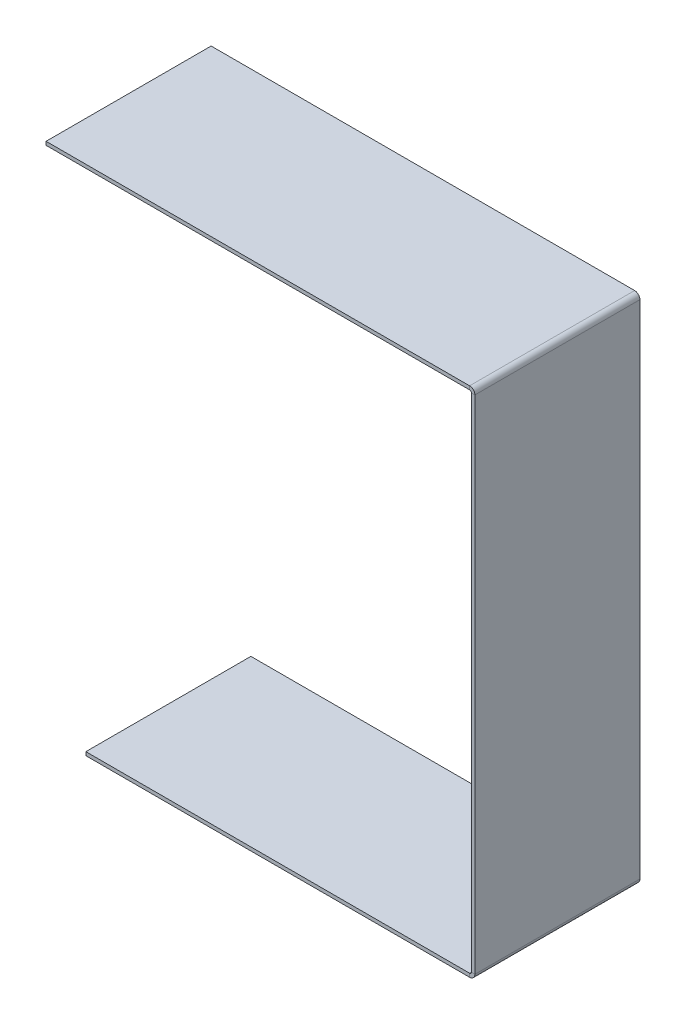
ISO-10303-21;
HEADER;
FILE_DESCRIPTION(('STEP AP214'),'2;1');
FILE_NAME('part.step','',(''),(''),'','','');
FILE_SCHEMA(('AUTOMOTIVE_DESIGN { 1 0 10303 214 1 1 1 1 }'));
ENDSEC;
DATA;
#1=APPLICATION_CONTEXT('core data for automotive mechanical design processes');
#2=APPLICATION_PROTOCOL_DEFINITION('international standard','automotive_design',2000,#1);
#3=PRODUCT_CONTEXT('',#1,'mechanical');
#4=PRODUCT('Part','Part','',(#3));
#5=PRODUCT_RELATED_PRODUCT_CATEGORY('part','',(#4));
#6=PRODUCT_DEFINITION_FORMATION('','',#4);
#7=PRODUCT_DEFINITION_CONTEXT('part definition',#1,'design');
#8=PRODUCT_DEFINITION('design','',#6,#7);
#9=PRODUCT_DEFINITION_SHAPE('','',#8);
#10=(LENGTH_UNIT() NAMED_UNIT(*) SI_UNIT(.MILLI.,.METRE.));
#11=(NAMED_UNIT(*) PLANE_ANGLE_UNIT() SI_UNIT($,.RADIAN.));
#12=(NAMED_UNIT(*) SI_UNIT($,.STERADIAN.) SOLID_ANGLE_UNIT());
#13=UNCERTAINTY_MEASURE_WITH_UNIT(LENGTH_MEASURE(1.E-05),#10,'distance_accuracy_value','');
#14=(GEOMETRIC_REPRESENTATION_CONTEXT(3) GLOBAL_UNCERTAINTY_ASSIGNED_CONTEXT((#13)) GLOBAL_UNIT_ASSIGNED_CONTEXT((#10,
#11,#12)) REPRESENTATION_CONTEXT('',''));
#15=CARTESIAN_POINT('',(0.,0.,0.));
#16=DIRECTION('',(0.,0.,1.));
#17=DIRECTION('',(1.,0.,0.));
#18=AXIS2_PLACEMENT_3D('',#15,#16,#17);
#19=CARTESIAN_POINT('',(-96.8897999999983,104.546799999999,93.673110700402));
#20=DIRECTION('',(1.,0.,0.));
#21=DIRECTION('',(0.,0.,-1.));
#22=AXIS2_PLACEMENT_3D('',#19,#20,#21);
#23=PLANE('',#22);
#24=DIRECTION('',(0.,0.,1.));
#25=VECTOR('',#24,1.);
#26=CARTESIAN_POINT('',(-96.8897999999983,103.046799999999,93.673110700402));
#27=LINE('',#26,#25);
#28=CARTESIAN_POINT('',(-96.8897999999983,103.046799999999,93.673110700402));
#29=VERTEX_POINT('',#28);
#30=CARTESIAN_POINT('',(-96.8897999999983,103.046799999999,163.673110700402));
#31=VERTEX_POINT('',#30);
#32=EDGE_CURVE('E143',#29,#31,#27,.T.);
#33=ORIENTED_EDGE('',*,*,#32,.T.);
#34=DIRECTION('',(0.,-1.,0.));
#35=VECTOR('',#34,1.);
#36=CARTESIAN_POINT('',(-96.8897999999983,104.546799999999,163.673110700402));
#37=LINE('',#36,#35);
#38=CARTESIAN_POINT('',(-96.8897999999983,104.546799999999,163.673110700402));
#39=VERTEX_POINT('',#38);
#40=EDGE_CURVE('E13',#39,#31,#37,.T.);
#41=ORIENTED_EDGE('',*,*,#40,.F.);
#42=DIRECTION('',(0.,0.,1.));
#43=VECTOR('',#42,1.);
#44=CARTESIAN_POINT('',(-96.8897999999983,104.546799999999,93.673110700402));
#45=LINE('',#44,#43);
#46=CARTESIAN_POINT('',(-96.8897999999983,104.546799999999,93.673110700402));
#47=VERTEX_POINT('',#46);
#48=EDGE_CURVE('E135',#47,#39,#45,.T.);
#49=ORIENTED_EDGE('',*,*,#48,.F.);
#50=DIRECTION('',(0.,-1.,0.));
#51=VECTOR('',#50,1.);
#52=CARTESIAN_POINT('',(-96.8897999999983,104.546799999999,93.673110700402));
#53=LINE('',#52,#51);
#54=EDGE_CURVE('E144',#47,#29,#53,.T.);
#55=ORIENTED_EDGE('',*,*,#54,.T.);
#56=EDGE_LOOP('',(#33,#41,#49,#55));
#57=FACE_BOUND('',#56,.T.);
#58=ADVANCED_FACE('F73',(#57),#23,.F.);
#59=CARTESIAN_POINT('',(-96.8897999999983,104.546799999999,163.673110700402));
#60=DIRECTION('',(0.,0.,-1.));
#61=DIRECTION('',(-1.,0.,0.));
#62=AXIS2_PLACEMENT_3D('',#59,#60,#61);
#63=PLANE('',#62);
#64=DIRECTION('',(1.,0.,0.));
#65=VECTOR('',#64,1.);
#66=CARTESIAN_POINT('',(-96.8897999999983,103.046799999999,163.673110700402));
#67=LINE('',#66,#65);
#68=CARTESIAN_POINT('',(82.7436000000014,103.046799999999,163.673110700401));
#69=VERTEX_POINT('',#68);
#70=EDGE_CURVE('E102',#31,#69,#67,.T.);
#71=ORIENTED_EDGE('',*,*,#70,.T.);
#72=DIRECTION('',(0.,-1.,0.));
#73=VECTOR('',#72,1.);
#74=CARTESIAN_POINT('',(82.7436000000014,104.546799999999,163.673110700401));
#75=LINE('',#74,#73);
#76=CARTESIAN_POINT('',(82.7436000000014,104.546799999999,163.673110700401));
#77=VERTEX_POINT('',#76);
#78=EDGE_CURVE('E81',#77,#69,#75,.T.);
#79=ORIENTED_EDGE('',*,*,#78,.F.);
#80=DIRECTION('',(1.,0.,0.));
#81=VECTOR('',#80,1.);
#82=CARTESIAN_POINT('',(-96.8897999999983,104.546799999999,163.673110700402));
#83=LINE('',#82,#81);
#84=EDGE_CURVE('E131',#39,#77,#83,.T.);
#85=ORIENTED_EDGE('',*,*,#84,.F.);
#86=ORIENTED_EDGE('',*,*,#40,.T.);
#87=EDGE_LOOP('',(#71,#79,#85,#86));
#88=FACE_BOUND('',#87,.T.);
#89=ADVANCED_FACE('F132',(#88),#63,.F.);
#90=CARTESIAN_POINT('',(-96.8897999999983,104.546799999999,93.673110700402));
#91=DIRECTION('',(0.,0.,1.));
#92=DIRECTION('',(1.,0.,0.));
#93=AXIS2_PLACEMENT_3D('',#90,#91,#92);
#94=PLANE('',#93);
#95=DIRECTION('',(-1.,0.,0.));
#96=VECTOR('',#95,1.);
#97=CARTESIAN_POINT('',(-96.8897999999983,103.046799999999,93.673110700402));
#98=LINE('',#97,#96);
#99=CARTESIAN_POINT('',(82.7436000000014,103.046799999999,93.6731107004013));
#100=VERTEX_POINT('',#99);
#101=EDGE_CURVE('E141',#100,#29,#98,.T.);
#102=ORIENTED_EDGE('',*,*,#101,.T.);
#103=ORIENTED_EDGE('',*,*,#54,.F.);
#104=DIRECTION('',(-1.,0.,0.));
#105=VECTOR('',#104,1.);
#106=CARTESIAN_POINT('',(-96.8897999999983,104.546799999999,93.673110700402));
#107=LINE('',#106,#105);
#108=CARTESIAN_POINT('',(82.7436000000014,104.546799999999,93.6731107004013));
#109=VERTEX_POINT('',#108);
#110=EDGE_CURVE('E89',#109,#47,#107,.T.);
#111=ORIENTED_EDGE('',*,*,#110,.F.);
#112=DIRECTION('',(0.,-1.,0.));
#113=VECTOR('',#112,1.);
#114=CARTESIAN_POINT('',(82.7436000000014,104.546799999999,93.6731107004013));
#115=LINE('',#114,#113);
#116=EDGE_CURVE('E159',#109,#100,#115,.T.);
#117=ORIENTED_EDGE('',*,*,#116,.T.);
#118=EDGE_LOOP('',(#102,#103,#111,#117));
#119=FACE_BOUND('',#118,.T.);
#120=ADVANCED_FACE('F179',(#119),#94,.F.);
#121=CARTESIAN_POINT('',(-96.8897999999983,104.546799999999,163.673110700402));
#122=DIRECTION('',(0.,1.,0.));
#123=DIRECTION('',(0.,0.,1.));
#124=AXIS2_PLACEMENT_3D('',#121,#122,#123);
#125=PLANE('',#124);
#126=ORIENTED_EDGE('',*,*,#48,.T.);
#127=ORIENTED_EDGE('',*,*,#84,.T.);
#128=DIRECTION('',(0.,0.,-1.));
#129=VECTOR('',#128,1.);
#130=CARTESIAN_POINT('',(82.7436000000014,104.546799999999,93.6731107004013));
#131=LINE('',#130,#129);
#132=EDGE_CURVE('E109',#77,#109,#131,.T.);
#133=ORIENTED_EDGE('',*,*,#132,.T.);
#134=ORIENTED_EDGE('',*,*,#110,.T.);
#135=EDGE_LOOP('',(#126,#127,#133,#134));
#136=FACE_BOUND('',#135,.T.);
#137=ADVANCED_FACE('F138',(#136),#125,.T.);
#138=CARTESIAN_POINT('',(-96.8897999999983,103.046799999999,163.673110700402));
#139=DIRECTION('',(0.,1.,0.));
#140=DIRECTION('',(0.,0.,1.));
#141=AXIS2_PLACEMENT_3D('',#138,#139,#140);
#142=PLANE('',#141);
#143=ORIENTED_EDGE('',*,*,#32,.F.);
#144=ORIENTED_EDGE('',*,*,#101,.F.);
#145=DIRECTION('',(0.,0.,-1.));
#146=VECTOR('',#145,1.);
#147=CARTESIAN_POINT('',(82.7436000000014,103.046799999999,93.6731107004013));
#148=LINE('',#147,#146);
#149=EDGE_CURVE('E148',#69,#100,#148,.T.);
#150=ORIENTED_EDGE('',*,*,#149,.F.);
#151=ORIENTED_EDGE('',*,*,#70,.F.);
#152=EDGE_LOOP('',(#143,#144,#150,#151));
#153=FACE_BOUND('',#152,.T.);
#154=ADVANCED_FACE('F177',(#153),#142,.F.);
#155=CARTESIAN_POINT('',(82.7436000000014,102.310199999999,93.6731107004013));
#156=DIRECTION('',(0.,0.,-1.));
#157=DIRECTION('',(-1.,0.,0.));
#158=AXIS2_PLACEMENT_3D('',#155,#156,#157);
#159=PLANE('',#158);
#160=DIRECTION('',(1.,0.,0.));
#161=VECTOR('',#160,1.);
#162=CARTESIAN_POINT('',(84.9802000000014,102.310199999999,93.6731107004013));
#163=LINE('',#162,#161);
#164=CARTESIAN_POINT('',(83.4802000000014,102.310199999999,93.6731107004013));
#165=VERTEX_POINT('',#164);
#166=CARTESIAN_POINT('',(84.9802000000014,102.310199999999,93.6731107004013));
#167=VERTEX_POINT('',#166);
#168=EDGE_CURVE('E187',#165,#167,#163,.T.);
#169=ORIENTED_EDGE('',*,*,#168,.F.);
#170=CARTESIAN_POINT('',(82.7436000000014,102.310199999999,93.6731107004013));
#171=DIRECTION('',(0.,0.,1.));
#172=DIRECTION('',(1.,0.,0.));
#173=AXIS2_PLACEMENT_3D('',#170,#171,#172);
#174=CIRCLE('',#173,0.736600000000004);
#175=EDGE_CURVE('E174',#100,#165,#174,.F.);
#176=ORIENTED_EDGE('',*,*,#175,.F.);
#177=ORIENTED_EDGE('',*,*,#116,.F.);
#178=CARTESIAN_POINT('',(82.7436000000014,102.310199999999,93.6731107004013));
#179=DIRECTION('',(0.,0.,1.));
#180=DIRECTION('',(1.,0.,0.));
#181=AXIS2_PLACEMENT_3D('',#178,#179,#180);
#182=CIRCLE('',#181,2.2366);
#183=EDGE_CURVE('E146',#109,#167,#182,.F.);
#184=ORIENTED_EDGE('',*,*,#183,.T.);
#185=EDGE_LOOP('',(#169,#176,#177,#184));
#186=FACE_BOUND('',#185,.T.);
#187=ADVANCED_FACE('F182',(#186),#159,.T.);
#188=CARTESIAN_POINT('',(82.7436000000014,102.310199999999,163.673110700401));
#189=DIRECTION('',(0.,0.,-1.));
#190=DIRECTION('',(-1.,0.,0.));
#191=AXIS2_PLACEMENT_3D('',#188,#189,#190);
#192=PLANE('',#191);
#193=CARTESIAN_POINT('',(82.7436000000014,102.310199999999,163.673110700401));
#194=DIRECTION('',(0.,0.,1.));
#195=DIRECTION('',(1.,0.,0.));
#196=AXIS2_PLACEMENT_3D('',#193,#194,#195);
#197=CIRCLE('',#196,0.736600000000004);
#198=CARTESIAN_POINT('',(83.4802000000014,102.310199999999,163.673110700401));
#199=VERTEX_POINT('',#198);
#200=EDGE_CURVE('E166',#199,#69,#197,.T.);
#201=ORIENTED_EDGE('',*,*,#200,.F.);
#202=DIRECTION('',(1.,0.,0.));
#203=VECTOR('',#202,1.);
#204=CARTESIAN_POINT('',(83.4802000000014,102.310199999999,163.673110700401));
#205=LINE('',#204,#203);
#206=CARTESIAN_POINT('',(84.9802000000014,102.310199999999,163.673110700401));
#207=VERTEX_POINT('',#206);
#208=EDGE_CURVE('E191',#199,#207,#205,.T.);
#209=ORIENTED_EDGE('',*,*,#208,.T.);
#210=CARTESIAN_POINT('',(82.7436000000014,102.310199999999,163.673110700401));
#211=DIRECTION('',(0.,0.,1.));
#212=DIRECTION('',(1.,0.,0.));
#213=AXIS2_PLACEMENT_3D('',#210,#211,#212);
#214=CIRCLE('',#213,2.2366);
#215=EDGE_CURVE('E151',#207,#77,#214,.T.);
#216=ORIENTED_EDGE('',*,*,#215,.T.);
#217=ORIENTED_EDGE('',*,*,#78,.T.);
#218=EDGE_LOOP('',(#201,#209,#216,#217));
#219=FACE_BOUND('',#218,.T.);
#220=ADVANCED_FACE('F164',(#219),#192,.F.);
#221=CARTESIAN_POINT('',(82.7436000000014,102.310199999999,163.673110700401));
#222=DIRECTION('',(0.,0.,1.));
#223=DIRECTION('',(1.,0.,0.));
#224=AXIS2_PLACEMENT_3D('',#221,#222,#223);
#225=CYLINDRICAL_SURFACE('',#224,2.2366);
#226=ORIENTED_EDGE('',*,*,#132,.F.);
#227=ORIENTED_EDGE('',*,*,#215,.F.);
#228=DIRECTION('',(0.,0.,1.));
#229=VECTOR('',#228,1.);
#230=CARTESIAN_POINT('',(84.9802000000014,102.310199999999,163.673110700401));
#231=LINE('',#230,#229);
#232=EDGE_CURVE('E193',#167,#207,#231,.T.);
#233=ORIENTED_EDGE('',*,*,#232,.F.);
#234=ORIENTED_EDGE('',*,*,#183,.F.);
#235=EDGE_LOOP('',(#226,#227,#233,#234));
#236=FACE_BOUND('',#235,.T.);
#237=ADVANCED_FACE('F360',(#236),#225,.T.);
#238=CARTESIAN_POINT('',(82.7436000000014,102.310199999999,163.673110700401));
#239=DIRECTION('',(0.,0.,1.));
#240=DIRECTION('',(1.,0.,0.));
#241=AXIS2_PLACEMENT_3D('',#238,#239,#240);
#242=CYLINDRICAL_SURFACE('',#241,0.736600000000004);
#243=ORIENTED_EDGE('',*,*,#149,.T.);
#244=ORIENTED_EDGE('',*,*,#175,.T.);
#245=DIRECTION('',(0.,0.,-1.));
#246=VECTOR('',#245,1.);
#247=CARTESIAN_POINT('',(83.4802000000014,102.310199999999,93.6731107004013));
#248=LINE('',#247,#246);
#249=EDGE_CURVE('E173',#165,#199,#248,.F.);
#250=ORIENTED_EDGE('',*,*,#249,.T.);
#251=ORIENTED_EDGE('',*,*,#200,.T.);
#252=EDGE_LOOP('',(#243,#244,#250,#251));
#253=FACE_BOUND('',#252,.T.);
#254=ADVANCED_FACE('F169',(#253),#242,.F.);
#255=CARTESIAN_POINT('',(84.9802000000014,103.046799999999,163.673110700401));
#256=DIRECTION('',(0.,0.,1.));
#257=DIRECTION('',(1.,0.,0.));
#258=AXIS2_PLACEMENT_3D('',#255,#256,#257);
#259=PLANE('',#258);
#260=DIRECTION('',(0.,1.,0.));
#261=VECTOR('',#260,1.);
#262=CARTESIAN_POINT('',(84.9802000000014,103.046799999999,163.673110700401));
#263=LINE('',#262,#261);
#264=CARTESIAN_POINT('',(84.9802000000021,-110.473200000001,163.673110700401));
#265=VERTEX_POINT('',#264);
#266=EDGE_CURVE('E210',#265,#207,#263,.T.);
#267=ORIENTED_EDGE('',*,*,#266,.T.);
#268=ORIENTED_EDGE('',*,*,#208,.F.);
#269=DIRECTION('',(0.,-1.,0.));
#270=VECTOR('',#269,1.);
#271=CARTESIAN_POINT('',(83.4802000000014,103.046799999999,163.673110700401));
#272=LINE('',#271,#270);
#273=CARTESIAN_POINT('',(83.4802000000021,-110.473200000001,163.673110700401));
#274=VERTEX_POINT('',#273);
#275=EDGE_CURVE('E202',#274,#199,#272,.F.);
#276=ORIENTED_EDGE('',*,*,#275,.F.);
#277=DIRECTION('',(-1.,0.,0.));
#278=VECTOR('',#277,1.);
#279=CARTESIAN_POINT('',(84.9802000000021,-110.473200000001,163.673110700401));
#280=LINE('',#279,#278);
#281=EDGE_CURVE('E175',#265,#274,#280,.T.);
#282=ORIENTED_EDGE('',*,*,#281,.F.);
#283=EDGE_LOOP('',(#267,#268,#276,#282));
#284=FACE_BOUND('',#283,.T.);
#285=ADVANCED_FACE('F329',(#284),#259,.T.);
#286=CARTESIAN_POINT('',(84.9802000000021,-110.473200000001,93.6731107004013));
#287=DIRECTION('',(0.,0.,-1.));
#288=DIRECTION('',(0.,1.,0.));
#289=AXIS2_PLACEMENT_3D('',#286,#287,#288);
#290=PLANE('',#289);
#291=DIRECTION('',(0.,1.,0.));
#292=VECTOR('',#291,1.);
#293=CARTESIAN_POINT('',(83.4802000000014,103.046799999999,93.6731107004013));
#294=LINE('',#293,#292);
#295=CARTESIAN_POINT('',(83.4802000000021,-110.473200000001,93.6731107004013));
#296=VERTEX_POINT('',#295);
#297=EDGE_CURVE('E196',#165,#296,#294,.F.);
#298=ORIENTED_EDGE('',*,*,#297,.F.);
#299=ORIENTED_EDGE('',*,*,#168,.T.);
#300=DIRECTION('',(0.,-1.,0.));
#301=VECTOR('',#300,1.);
#302=CARTESIAN_POINT('',(84.9802000000021,-110.473200000001,93.6731107004013));
#303=LINE('',#302,#301);
#304=CARTESIAN_POINT('',(84.9802000000021,-110.473200000001,93.6731107004013));
#305=VERTEX_POINT('',#304);
#306=EDGE_CURVE('E204',#167,#305,#303,.T.);
#307=ORIENTED_EDGE('',*,*,#306,.T.);
#308=DIRECTION('',(-1.,0.,0.));
#309=VECTOR('',#308,1.);
#310=CARTESIAN_POINT('',(84.9802000000021,-110.473200000001,93.6731107004013));
#311=LINE('',#310,#309);
#312=EDGE_CURVE('E213',#305,#296,#311,.T.);
#313=ORIENTED_EDGE('',*,*,#312,.T.);
#314=EDGE_LOOP('',(#298,#299,#307,#313));
#315=FACE_BOUND('',#314,.T.);
#316=ADVANCED_FACE('F335',(#315),#290,.T.);
#317=CARTESIAN_POINT('',(84.9802000000014,103.046799999999,163.673110700401));
#318=DIRECTION('',(1.,0.,0.));
#319=DIRECTION('',(0.,1.,0.));
#320=AXIS2_PLACEMENT_3D('',#317,#318,#319);
#321=PLANE('',#320);
#322=ORIENTED_EDGE('',*,*,#306,.F.);
#323=ORIENTED_EDGE('',*,*,#232,.T.);
#324=ORIENTED_EDGE('',*,*,#266,.F.);
#325=DIRECTION('',(0.,0.,1.));
#326=VECTOR('',#325,1.);
#327=CARTESIAN_POINT('',(84.9802000000021,-110.473200000001,163.673110700401));
#328=LINE('',#327,#326);
#329=EDGE_CURVE('E207',#305,#265,#328,.T.);
#330=ORIENTED_EDGE('',*,*,#329,.F.);
#331=EDGE_LOOP('',(#322,#323,#324,#330));
#332=FACE_BOUND('',#331,.T.);
#333=ADVANCED_FACE('F325',(#332),#321,.T.);
#334=CARTESIAN_POINT('',(83.4802000000014,103.046799999999,163.673110700401));
#335=DIRECTION('',(1.,0.,0.));
#336=DIRECTION('',(0.,1.,0.));
#337=AXIS2_PLACEMENT_3D('',#334,#335,#336);
#338=PLANE('',#337);
#339=ORIENTED_EDGE('',*,*,#249,.F.);
#340=ORIENTED_EDGE('',*,*,#297,.T.);
#341=DIRECTION('',(0.,0.,-1.));
#342=VECTOR('',#341,1.);
#343=CARTESIAN_POINT('',(83.4802000000021,-110.473200000001,163.673110700401));
#344=LINE('',#343,#342);
#345=EDGE_CURVE('E199',#296,#274,#344,.F.);
#346=ORIENTED_EDGE('',*,*,#345,.T.);
#347=ORIENTED_EDGE('',*,*,#275,.T.);
#348=EDGE_LOOP('',(#339,#340,#346,#347));
#349=FACE_BOUND('',#348,.T.);
#350=ADVANCED_FACE('F333',(#349),#338,.F.);
#351=CARTESIAN_POINT('',(82.7436000000021,-110.473200000001,93.6731107004013));
#352=DIRECTION('',(0.,0.,-1.));
#353=DIRECTION('',(-1.,0.,0.));
#354=AXIS2_PLACEMENT_3D('',#351,#352,#353);
#355=PLANE('',#354);
#356=DIRECTION('',(0.,-1.,0.));
#357=VECTOR('',#356,1.);
#358=CARTESIAN_POINT('',(82.7436000000021,-112.709800000001,93.6731107004013));
#359=LINE('',#358,#357);
#360=CARTESIAN_POINT('',(82.7436000000021,-111.209800000001,93.6731107004013));
#361=VERTEX_POINT('',#360);
#362=CARTESIAN_POINT('',(82.7436000000021,-112.709800000001,93.6731107004013));
#363=VERTEX_POINT('',#362);
#364=EDGE_CURVE('E230',#361,#363,#359,.T.);
#365=ORIENTED_EDGE('',*,*,#364,.F.);
#366=CARTESIAN_POINT('',(82.7436000000021,-110.473200000001,93.6731107004013));
#367=DIRECTION('',(0.,0.,1.));
#368=DIRECTION('',(1.,0.,0.));
#369=AXIS2_PLACEMENT_3D('',#366,#367,#368);
#370=CIRCLE('',#369,0.736600000000004);
#371=EDGE_CURVE('E221',#296,#361,#370,.F.);
#372=ORIENTED_EDGE('',*,*,#371,.F.);
#373=ORIENTED_EDGE('',*,*,#312,.F.);
#374=CARTESIAN_POINT('',(82.7436000000021,-110.473200000001,93.6731107004013));
#375=DIRECTION('',(0.,0.,1.));
#376=DIRECTION('',(1.,0.,0.));
#377=AXIS2_PLACEMENT_3D('',#374,#375,#376);
#378=CIRCLE('',#377,2.2366);
#379=EDGE_CURVE('E189',#305,#363,#378,.F.);
#380=ORIENTED_EDGE('',*,*,#379,.T.);
#381=EDGE_LOOP('',(#365,#372,#373,#380));
#382=FACE_BOUND('',#381,.T.);
#383=ADVANCED_FACE('F307',(#382),#355,.T.);
#384=CARTESIAN_POINT('',(82.7436000000021,-110.473200000001,163.673110700401));
#385=DIRECTION('',(0.,0.,-1.));
#386=DIRECTION('',(-1.,0.,0.));
#387=AXIS2_PLACEMENT_3D('',#384,#385,#386);
#388=PLANE('',#387);
#389=CARTESIAN_POINT('',(82.7436000000021,-110.473200000001,163.673110700401));
#390=DIRECTION('',(0.,0.,1.));
#391=DIRECTION('',(1.,0.,0.));
#392=AXIS2_PLACEMENT_3D('',#389,#390,#391);
#393=CIRCLE('',#392,0.736600000000004);
#394=CARTESIAN_POINT('',(82.7436000000021,-111.209800000001,163.673110700401));
#395=VERTEX_POINT('',#394);
#396=EDGE_CURVE('E218',#395,#274,#393,.T.);
#397=ORIENTED_EDGE('',*,*,#396,.F.);
#398=DIRECTION('',(0.,-1.,0.));
#399=VECTOR('',#398,1.);
#400=CARTESIAN_POINT('',(82.7436000000021,-111.209800000001,163.673110700401));
#401=LINE('',#400,#399);
#402=CARTESIAN_POINT('',(82.7436000000021,-112.709800000001,163.673110700401));
#403=VERTEX_POINT('',#402);
#404=EDGE_CURVE('E236',#395,#403,#401,.T.);
#405=ORIENTED_EDGE('',*,*,#404,.T.);
#406=CARTESIAN_POINT('',(82.7436000000021,-110.473200000001,163.673110700401));
#407=DIRECTION('',(0.,0.,1.));
#408=DIRECTION('',(1.,0.,0.));
#409=AXIS2_PLACEMENT_3D('',#406,#407,#408);
#410=CIRCLE('',#409,2.2366);
#411=EDGE_CURVE('E225',#403,#265,#410,.T.);
#412=ORIENTED_EDGE('',*,*,#411,.T.);
#413=ORIENTED_EDGE('',*,*,#281,.T.);
#414=EDGE_LOOP('',(#397,#405,#412,#413));
#415=FACE_BOUND('',#414,.T.);
#416=ADVANCED_FACE('F291',(#415),#388,.F.);
#417=CARTESIAN_POINT('',(82.7436000000021,-110.473200000001,163.673110700401));
#418=DIRECTION('',(0.,0.,1.));
#419=DIRECTION('',(0.,-1.,0.));
#420=AXIS2_PLACEMENT_3D('',#417,#418,#419);
#421=CYLINDRICAL_SURFACE('',#420,2.2366);
#422=ORIENTED_EDGE('',*,*,#329,.T.);
#423=ORIENTED_EDGE('',*,*,#411,.F.);
#424=DIRECTION('',(0.,0.,1.));
#425=VECTOR('',#424,1.);
#426=CARTESIAN_POINT('',(82.7436000000021,-112.709800000001,163.673110700401));
#427=LINE('',#426,#425);
#428=EDGE_CURVE('E239',#363,#403,#427,.T.);
#429=ORIENTED_EDGE('',*,*,#428,.F.);
#430=ORIENTED_EDGE('',*,*,#379,.F.);
#431=EDGE_LOOP('',(#422,#423,#429,#430));
#432=FACE_BOUND('',#431,.T.);
#433=ADVANCED_FACE('F301',(#432),#421,.T.);
#434=CARTESIAN_POINT('',(82.7436000000021,-110.473200000001,163.673110700401));
#435=DIRECTION('',(0.,0.,1.));
#436=DIRECTION('',(0.,-1.,0.));
#437=AXIS2_PLACEMENT_3D('',#434,#435,#436);
#438=CYLINDRICAL_SURFACE('',#437,0.736600000000004);
#439=ORIENTED_EDGE('',*,*,#345,.F.);
#440=ORIENTED_EDGE('',*,*,#371,.T.);
#441=DIRECTION('',(0.,0.,-1.));
#442=VECTOR('',#441,1.);
#443=CARTESIAN_POINT('',(82.7436000000021,-111.209800000001,93.6731107004013));
#444=LINE('',#443,#442);
#445=EDGE_CURVE('E233',#361,#395,#444,.F.);
#446=ORIENTED_EDGE('',*,*,#445,.T.);
#447=ORIENTED_EDGE('',*,*,#396,.T.);
#448=EDGE_LOOP('',(#439,#440,#446,#447));
#449=FACE_BOUND('',#448,.T.);
#450=ADVANCED_FACE('F332',(#449),#438,.F.);
#451=CARTESIAN_POINT('',(83.4802000000021,-112.709800000001,163.673110700401));
#452=DIRECTION('',(0.,0.,1.));
#453=DIRECTION('',(1.,0.,0.));
#454=AXIS2_PLACEMENT_3D('',#451,#452,#453);
#455=PLANE('',#454);
#456=DIRECTION('',(1.,0.,0.));
#457=VECTOR('',#456,1.);
#458=CARTESIAN_POINT('',(83.4802000000021,-112.709800000001,163.673110700401));
#459=LINE('',#458,#457);
#460=CARTESIAN_POINT('',(-80.0197999999979,-112.709800000002,163.673110700401));
#461=VERTEX_POINT('',#460);
#462=EDGE_CURVE('E257',#461,#403,#459,.T.);
#463=ORIENTED_EDGE('',*,*,#462,.T.);
#464=ORIENTED_EDGE('',*,*,#404,.F.);
#465=DIRECTION('',(-1.,0.,0.));
#466=VECTOR('',#465,1.);
#467=CARTESIAN_POINT('',(83.4802000000021,-111.209800000001,163.673110700401));
#468=LINE('',#467,#466);
#469=CARTESIAN_POINT('',(-80.0197999999979,-111.209800000002,163.673110700401));
#470=VERTEX_POINT('',#469);
#471=EDGE_CURVE('E248',#470,#395,#468,.F.);
#472=ORIENTED_EDGE('',*,*,#471,.F.);
#473=DIRECTION('',(0.,1.,0.));
#474=VECTOR('',#473,1.);
#475=CARTESIAN_POINT('',(-80.0197999999979,-112.709800000002,163.673110700401));
#476=LINE('',#475,#474);
#477=EDGE_CURVE('E222',#461,#470,#476,.T.);
#478=ORIENTED_EDGE('',*,*,#477,.F.);
#479=EDGE_LOOP('',(#463,#464,#472,#478));
#480=FACE_BOUND('',#479,.T.);
#481=ADVANCED_FACE('F284',(#480),#455,.T.);
#482=CARTESIAN_POINT('',(-80.0197999999979,-112.709800000002,93.6731107004013));
#483=DIRECTION('',(0.,0.,-1.));
#484=DIRECTION('',(-1.,0.,0.));
#485=AXIS2_PLACEMENT_3D('',#482,#483,#484);
#486=PLANE('',#485);
#487=DIRECTION('',(1.,0.,0.));
#488=VECTOR('',#487,1.);
#489=CARTESIAN_POINT('',(83.4802000000021,-111.209800000001,93.6731107004013));
#490=LINE('',#489,#488);
#491=CARTESIAN_POINT('',(-80.0197999999979,-111.209800000002,93.6731107004013));
#492=VERTEX_POINT('',#491);
#493=EDGE_CURVE('E242',#361,#492,#490,.F.);
#494=ORIENTED_EDGE('',*,*,#493,.F.);
#495=ORIENTED_EDGE('',*,*,#364,.T.);
#496=DIRECTION('',(-1.,0.,0.));
#497=VECTOR('',#496,1.);
#498=CARTESIAN_POINT('',(-80.0197999999979,-112.709800000002,93.6731107004013));
#499=LINE('',#498,#497);
#500=CARTESIAN_POINT('',(-80.0197999999979,-112.709800000002,93.6731107004013));
#501=VERTEX_POINT('',#500);
#502=EDGE_CURVE('E251',#363,#501,#499,.T.);
#503=ORIENTED_EDGE('',*,*,#502,.T.);
#504=DIRECTION('',(0.,1.,0.));
#505=VECTOR('',#504,1.);
#506=CARTESIAN_POINT('',(-80.0197999999979,-112.709800000002,93.6731107004013));
#507=LINE('',#506,#505);
#508=EDGE_CURVE('E260',#501,#492,#507,.T.);
#509=ORIENTED_EDGE('',*,*,#508,.T.);
#510=EDGE_LOOP('',(#494,#495,#503,#509));
#511=FACE_BOUND('',#510,.T.);
#512=ADVANCED_FACE('F310',(#511),#486,.T.);
#513=CARTESIAN_POINT('',(83.4802000000021,-112.709800000001,163.673110700401));
#514=DIRECTION('',(0.,-1.,0.));
#515=DIRECTION('',(1.,0.,0.));
#516=AXIS2_PLACEMENT_3D('',#513,#514,#515);
#517=PLANE('',#516);
#518=ORIENTED_EDGE('',*,*,#502,.F.);
#519=ORIENTED_EDGE('',*,*,#428,.T.);
#520=ORIENTED_EDGE('',*,*,#462,.F.);
#521=DIRECTION('',(0.,0.,1.));
#522=VECTOR('',#521,1.);
#523=CARTESIAN_POINT('',(-80.0197999999979,-112.709800000002,163.673110700401));
#524=LINE('',#523,#522);
#525=EDGE_CURVE('E254',#501,#461,#524,.T.);
#526=ORIENTED_EDGE('',*,*,#525,.F.);
#527=EDGE_LOOP('',(#518,#519,#520,#526));
#528=FACE_BOUND('',#527,.T.);
#529=ADVANCED_FACE('F298',(#528),#517,.T.);
#530=CARTESIAN_POINT('',(83.4802000000021,-111.209800000001,163.673110700401));
#531=DIRECTION('',(0.,-1.,0.));
#532=DIRECTION('',(1.,0.,0.));
#533=AXIS2_PLACEMENT_3D('',#530,#531,#532);
#534=PLANE('',#533);
#535=ORIENTED_EDGE('',*,*,#445,.F.);
#536=ORIENTED_EDGE('',*,*,#493,.T.);
#537=DIRECTION('',(0.,0.,-1.));
#538=VECTOR('',#537,1.);
#539=CARTESIAN_POINT('',(-80.0197999999979,-111.209800000002,163.673110700401));
#540=LINE('',#539,#538);
#541=EDGE_CURVE('E245',#492,#470,#540,.F.);
#542=ORIENTED_EDGE('',*,*,#541,.T.);
#543=ORIENTED_EDGE('',*,*,#471,.T.);
#544=EDGE_LOOP('',(#535,#536,#542,#543));
#545=FACE_BOUND('',#544,.T.);
#546=ADVANCED_FACE('F280',(#545),#534,.F.);
#547=CARTESIAN_POINT('',(-80.0197999999979,-112.709800000002,163.673110700401));
#548=DIRECTION('',(-1.,0.,0.));
#549=DIRECTION('',(0.,-1.,0.));
#550=AXIS2_PLACEMENT_3D('',#547,#548,#549);
#551=PLANE('',#550);
#552=ORIENTED_EDGE('',*,*,#541,.F.);
#553=ORIENTED_EDGE('',*,*,#508,.F.);
#554=ORIENTED_EDGE('',*,*,#525,.T.);
#555=ORIENTED_EDGE('',*,*,#477,.T.);
#556=EDGE_LOOP('',(#552,#553,#554,#555));
#557=FACE_BOUND('',#556,.T.);
#558=ADVANCED_FACE('F268',(#557),#551,.T.);
#559=CLOSED_SHELL('',(#58,#89,#120,#137,#154,#187,#220,#237,#254,#285,#316,#333,#350,#383,#416,
#433,#450,#481,#512,#529,#546,#558));
#560=MANIFOLD_SOLID_BREP('B2',#559);
#561=ADVANCED_BREP_SHAPE_REPRESENTATION('',(#18,#560),#14);
#562=SHAPE_DEFINITION_REPRESENTATION(#9,#561);
ENDSEC;
END-ISO-10303-21;
